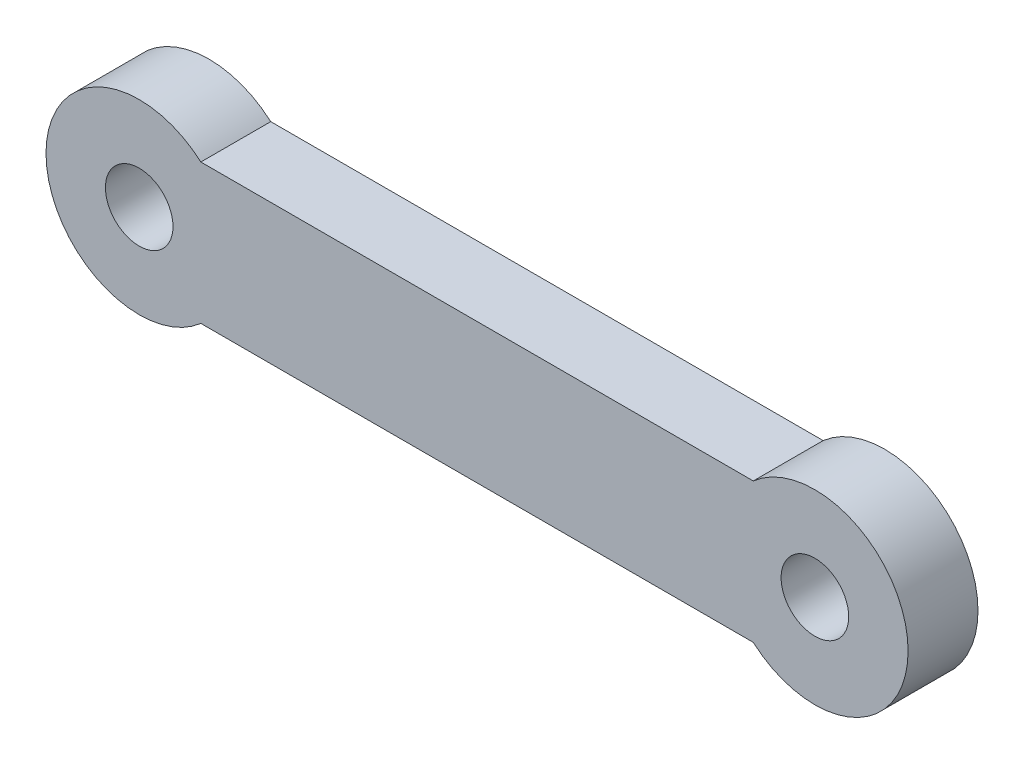
ISO-10303-21;
HEADER;
FILE_DESCRIPTION(('STEP AP214'),'2;1');
FILE_NAME('part.step','',(''),(''),'','','');
FILE_SCHEMA(('AUTOMOTIVE_DESIGN { 1 0 10303 214 1 1 1 1 }'));
ENDSEC;
DATA;
#1=APPLICATION_CONTEXT('core data for automotive mechanical design processes');
#2=APPLICATION_PROTOCOL_DEFINITION('international standard','automotive_design',2000,#1);
#3=PRODUCT_CONTEXT('',#1,'mechanical');
#4=PRODUCT('Part','Part','',(#3));
#5=PRODUCT_RELATED_PRODUCT_CATEGORY('part','',(#4));
#6=PRODUCT_DEFINITION_FORMATION('','',#4);
#7=PRODUCT_DEFINITION_CONTEXT('part definition',#1,'design');
#8=PRODUCT_DEFINITION('design','',#6,#7);
#9=PRODUCT_DEFINITION_SHAPE('','',#8);
#10=(LENGTH_UNIT() NAMED_UNIT(*) SI_UNIT(.MILLI.,.METRE.));
#11=(NAMED_UNIT(*) PLANE_ANGLE_UNIT() SI_UNIT($,.RADIAN.));
#12=(NAMED_UNIT(*) SI_UNIT($,.STERADIAN.) SOLID_ANGLE_UNIT());
#13=UNCERTAINTY_MEASURE_WITH_UNIT(LENGTH_MEASURE(1.E-05),#10,'distance_accuracy_value','');
#14=(GEOMETRIC_REPRESENTATION_CONTEXT(3) GLOBAL_UNCERTAINTY_ASSIGNED_CONTEXT((#13)) GLOBAL_UNIT_ASSIGNED_CONTEXT((#10,
#11,#12)) REPRESENTATION_CONTEXT('',''));
#15=CARTESIAN_POINT('',(0.,0.,0.));
#16=DIRECTION('',(0.,0.,1.));
#17=DIRECTION('',(1.,0.,0.));
#18=AXIS2_PLACEMENT_3D('',#15,#16,#17);
#19=CARTESIAN_POINT('',(-3.,0.,3.));
#20=DIRECTION('',(0.,0.,1.));
#21=DIRECTION('',(1.,0.,0.));
#22=AXIS2_PLACEMENT_3D('',#19,#20,#21);
#23=PLANE('',#22);
#24=CARTESIAN_POINT('',(-3.,0.,3.));
#25=DIRECTION('',(0.,0.,1.));
#26=DIRECTION('',(1.,0.,0.));
#27=AXIS2_PLACEMENT_3D('',#24,#25,#26);
#28=CIRCLE('',#27,1.45);
#29=CARTESIAN_POINT('',(-1.55,0.,3.));
#30=VERTEX_POINT('',#29);
#31=EDGE_CURVE('E102',#30,#30,#28,.T.);
#32=ORIENTED_EDGE('',*,*,#31,.F.);
#33=EDGE_LOOP('',(#32));
#34=FACE_BOUND('',#33,.T.);
#35=CARTESIAN_POINT('',(-3.,0.,3.));
#36=DIRECTION('',(0.,0.,1.));
#37=DIRECTION('',(1.,0.,0.));
#38=AXIS2_PLACEMENT_3D('',#35,#36,#37);
#39=CIRCLE('',#38,4.);
#40=CARTESIAN_POINT('',(-5.64575131106459,-3.,3.));
#41=VERTEX_POINT('',#40);
#42=CARTESIAN_POINT('',(-5.64575131106459,3.,3.));
#43=VERTEX_POINT('',#42);
#44=EDGE_CURVE('E87',#41,#43,#39,.T.);
#45=ORIENTED_EDGE('',*,*,#44,.T.);
#46=DIRECTION('',(-1.,0.,0.));
#47=VECTOR('',#46,1.);
#48=CARTESIAN_POINT('',(-29.3542486889354,3.,3.));
#49=LINE('',#48,#47);
#50=CARTESIAN_POINT('',(-29.3542486889354,3.,3.));
#51=VERTEX_POINT('',#50);
#52=EDGE_CURVE('E82',#43,#51,#49,.T.);
#53=ORIENTED_EDGE('',*,*,#52,.T.);
#54=CARTESIAN_POINT('',(-32.,0.,3.));
#55=DIRECTION('',(0.,0.,1.));
#56=DIRECTION('',(1.,0.,0.));
#57=AXIS2_PLACEMENT_3D('',#54,#55,#56);
#58=CIRCLE('',#57,4.);
#59=CARTESIAN_POINT('',(-29.3542486889354,-3.,3.));
#60=VERTEX_POINT('',#59);
#61=EDGE_CURVE('E85',#51,#60,#58,.T.);
#62=ORIENTED_EDGE('',*,*,#61,.T.);
#63=DIRECTION('',(1.,0.,0.));
#64=VECTOR('',#63,1.);
#65=CARTESIAN_POINT('',(-29.3542486889354,-3.,3.));
#66=LINE('',#65,#64);
#67=EDGE_CURVE('E52',#60,#41,#66,.T.);
#68=ORIENTED_EDGE('',*,*,#67,.T.);
#69=EDGE_LOOP('',(#45,#53,#62,#68));
#70=FACE_BOUND('',#69,.T.);
#71=CARTESIAN_POINT('',(-32.,0.,3.));
#72=DIRECTION('',(0.,0.,1.));
#73=DIRECTION('',(1.,0.,0.));
#74=AXIS2_PLACEMENT_3D('',#71,#72,#73);
#75=CIRCLE('',#74,1.45);
#76=CARTESIAN_POINT('',(-30.55,0.,3.));
#77=VERTEX_POINT('',#76);
#78=EDGE_CURVE('E117',#77,#77,#75,.T.);
#79=ORIENTED_EDGE('',*,*,#78,.F.);
#80=EDGE_LOOP('',(#79));
#81=FACE_BOUND('',#80,.T.);
#82=ADVANCED_FACE('F35',(#34,#70,#81),#23,.T.);
#83=CARTESIAN_POINT('',(-3.,0.,0.));
#84=DIRECTION('',(0.,0.,1.));
#85=DIRECTION('',(1.,0.,0.));
#86=AXIS2_PLACEMENT_3D('',#83,#84,#85);
#87=PLANE('',#86);
#88=CARTESIAN_POINT('',(-3.,0.,0.));
#89=DIRECTION('',(0.,0.,1.));
#90=DIRECTION('',(1.,0.,0.));
#91=AXIS2_PLACEMENT_3D('',#88,#89,#90);
#92=CIRCLE('',#91,4.);
#93=CARTESIAN_POINT('',(-5.64575131106459,-3.,0.));
#94=VERTEX_POINT('',#93);
#95=CARTESIAN_POINT('',(-5.64575131106459,3.,0.));
#96=VERTEX_POINT('',#95);
#97=EDGE_CURVE('E99',#94,#96,#92,.T.);
#98=ORIENTED_EDGE('',*,*,#97,.F.);
#99=DIRECTION('',(1.,0.,0.));
#100=VECTOR('',#99,1.);
#101=CARTESIAN_POINT('',(-29.3542486889354,-3.,0.));
#102=LINE('',#101,#100);
#103=CARTESIAN_POINT('',(-29.3542486889354,-3.,0.));
#104=VERTEX_POINT('',#103);
#105=EDGE_CURVE('E75',#104,#94,#102,.T.);
#106=ORIENTED_EDGE('',*,*,#105,.F.);
#107=CARTESIAN_POINT('',(-32.,0.,0.));
#108=DIRECTION('',(0.,0.,1.));
#109=DIRECTION('',(1.,0.,0.));
#110=AXIS2_PLACEMENT_3D('',#107,#108,#109);
#111=CIRCLE('',#110,4.);
#112=CARTESIAN_POINT('',(-29.3542486889354,3.,0.));
#113=VERTEX_POINT('',#112);
#114=EDGE_CURVE('E69',#113,#104,#111,.T.);
#115=ORIENTED_EDGE('',*,*,#114,.F.);
#116=DIRECTION('',(-1.,0.,0.));
#117=VECTOR('',#116,1.);
#118=CARTESIAN_POINT('',(-29.3542486889354,3.,0.));
#119=LINE('',#118,#117);
#120=EDGE_CURVE('E91',#96,#113,#119,.T.);
#121=ORIENTED_EDGE('',*,*,#120,.F.);
#122=EDGE_LOOP('',(#98,#106,#115,#121));
#123=FACE_BOUND('',#122,.T.);
#124=CARTESIAN_POINT('',(-3.,0.,0.));
#125=DIRECTION('',(0.,0.,1.));
#126=DIRECTION('',(1.,0.,0.));
#127=AXIS2_PLACEMENT_3D('',#124,#125,#126);
#128=CIRCLE('',#127,1.45);
#129=CARTESIAN_POINT('',(-1.55,0.,0.));
#130=VERTEX_POINT('',#129);
#131=EDGE_CURVE('E114',#130,#130,#128,.T.);
#132=ORIENTED_EDGE('',*,*,#131,.T.);
#133=EDGE_LOOP('',(#132));
#134=FACE_BOUND('',#133,.T.);
#135=CARTESIAN_POINT('',(-32.,0.,0.));
#136=DIRECTION('',(0.,0.,1.));
#137=DIRECTION('',(1.,0.,0.));
#138=AXIS2_PLACEMENT_3D('',#135,#136,#137);
#139=CIRCLE('',#138,1.45);
#140=CARTESIAN_POINT('',(-30.55,0.,0.));
#141=VERTEX_POINT('',#140);
#142=EDGE_CURVE('E120',#141,#141,#139,.T.);
#143=ORIENTED_EDGE('',*,*,#142,.T.);
#144=EDGE_LOOP('',(#143));
#145=FACE_BOUND('',#144,.T.);
#146=ADVANCED_FACE('F110',(#123,#134,#145),#87,.F.);
#147=CARTESIAN_POINT('',(-3.,0.,3.));
#148=DIRECTION('',(0.,0.,-1.));
#149=DIRECTION('',(-1.,0.,0.));
#150=AXIS2_PLACEMENT_3D('',#147,#148,#149);
#151=CYLINDRICAL_SURFACE('',#150,4.);
#152=ORIENTED_EDGE('',*,*,#97,.T.);
#153=DIRECTION('',(0.,0.,-1.));
#154=VECTOR('',#153,1.);
#155=CARTESIAN_POINT('',(-5.64575131106459,3.,3.));
#156=LINE('',#155,#154);
#157=EDGE_CURVE('E11',#43,#96,#156,.T.);
#158=ORIENTED_EDGE('',*,*,#157,.F.);
#159=ORIENTED_EDGE('',*,*,#44,.F.);
#160=DIRECTION('',(0.,0.,-1.));
#161=VECTOR('',#160,1.);
#162=CARTESIAN_POINT('',(-5.64575131106459,-3.,3.));
#163=LINE('',#162,#161);
#164=EDGE_CURVE('E95',#41,#94,#163,.T.);
#165=ORIENTED_EDGE('',*,*,#164,.T.);
#166=EDGE_LOOP('',(#152,#158,#159,#165));
#167=FACE_BOUND('',#166,.T.);
#168=ADVANCED_FACE('F37',(#167),#151,.T.);
#169=CARTESIAN_POINT('',(-29.3542486889354,3.,3.));
#170=DIRECTION('',(0.,-1.,0.));
#171=DIRECTION('',(1.,0.,0.));
#172=AXIS2_PLACEMENT_3D('',#169,#170,#171);
#173=PLANE('',#172);
#174=ORIENTED_EDGE('',*,*,#120,.T.);
#175=DIRECTION('',(0.,0.,-1.));
#176=VECTOR('',#175,1.);
#177=CARTESIAN_POINT('',(-29.3542486889354,3.,3.));
#178=LINE('',#177,#176);
#179=EDGE_CURVE('E44',#51,#113,#178,.T.);
#180=ORIENTED_EDGE('',*,*,#179,.F.);
#181=ORIENTED_EDGE('',*,*,#52,.F.);
#182=ORIENTED_EDGE('',*,*,#157,.T.);
#183=EDGE_LOOP('',(#174,#180,#181,#182));
#184=FACE_BOUND('',#183,.T.);
#185=ADVANCED_FACE('F90',(#184),#173,.F.);
#186=CARTESIAN_POINT('',(-32.,0.,3.));
#187=DIRECTION('',(0.,0.,-1.));
#188=DIRECTION('',(-1.,0.,0.));
#189=AXIS2_PLACEMENT_3D('',#186,#187,#188);
#190=CYLINDRICAL_SURFACE('',#189,4.);
#191=ORIENTED_EDGE('',*,*,#114,.T.);
#192=DIRECTION('',(0.,0.,-1.));
#193=VECTOR('',#192,1.);
#194=CARTESIAN_POINT('',(-29.3542486889354,-3.,3.));
#195=LINE('',#194,#193);
#196=EDGE_CURVE('E92',#60,#104,#195,.T.);
#197=ORIENTED_EDGE('',*,*,#196,.F.);
#198=ORIENTED_EDGE('',*,*,#61,.F.);
#199=ORIENTED_EDGE('',*,*,#179,.T.);
#200=EDGE_LOOP('',(#191,#197,#198,#199));
#201=FACE_BOUND('',#200,.T.);
#202=ADVANCED_FACE('F93',(#201),#190,.T.);
#203=CARTESIAN_POINT('',(-29.3542486889354,-3.,3.));
#204=DIRECTION('',(0.,1.,0.));
#205=DIRECTION('',(-1.,0.,0.));
#206=AXIS2_PLACEMENT_3D('',#203,#204,#205);
#207=PLANE('',#206);
#208=ORIENTED_EDGE('',*,*,#105,.T.);
#209=ORIENTED_EDGE('',*,*,#164,.F.);
#210=ORIENTED_EDGE('',*,*,#67,.F.);
#211=ORIENTED_EDGE('',*,*,#196,.T.);
#212=EDGE_LOOP('',(#208,#209,#210,#211));
#213=FACE_BOUND('',#212,.T.);
#214=ADVANCED_FACE('F107',(#213),#207,.F.);
#215=CARTESIAN_POINT('',(-3.,0.,3.));
#216=DIRECTION('',(0.,0.,-1.));
#217=DIRECTION('',(-1.,0.,0.));
#218=AXIS2_PLACEMENT_3D('',#215,#216,#217);
#219=CYLINDRICAL_SURFACE('',#218,1.45);
#220=ORIENTED_EDGE('',*,*,#31,.T.);
#221=EDGE_LOOP('',(#220));
#222=FACE_BOUND('',#221,.T.);
#223=ORIENTED_EDGE('',*,*,#131,.F.);
#224=EDGE_LOOP('',(#223));
#225=FACE_BOUND('',#224,.T.);
#226=ADVANCED_FACE('F137',(#222,#225),#219,.F.);
#227=CARTESIAN_POINT('',(-32.,0.,3.));
#228=DIRECTION('',(0.,0.,-1.));
#229=DIRECTION('',(-1.,0.,0.));
#230=AXIS2_PLACEMENT_3D('',#227,#228,#229);
#231=CYLINDRICAL_SURFACE('',#230,1.45);
#232=ORIENTED_EDGE('',*,*,#78,.T.);
#233=EDGE_LOOP('',(#232));
#234=FACE_BOUND('',#233,.T.);
#235=ORIENTED_EDGE('',*,*,#142,.F.);
#236=EDGE_LOOP('',(#235));
#237=FACE_BOUND('',#236,.T.);
#238=ADVANCED_FACE('F126',(#234,#237),#231,.F.);
#239=CLOSED_SHELL('',(#82,#146,#168,#185,#202,#214,#226,#238));
#240=MANIFOLD_SOLID_BREP('B2',#239);
#241=ADVANCED_BREP_SHAPE_REPRESENTATION('',(#18,#240),#14);
#242=SHAPE_DEFINITION_REPRESENTATION(#9,#241);
ENDSEC;
END-ISO-10303-21;
